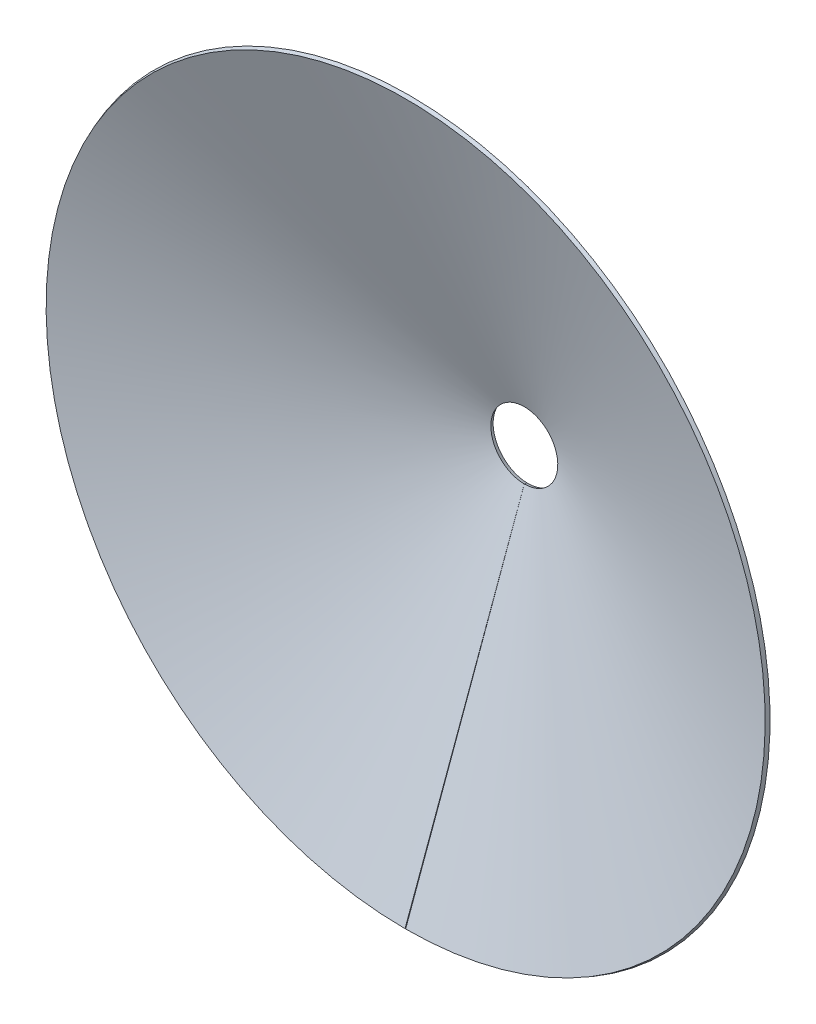
ISO-10303-21;
HEADER;
FILE_DESCRIPTION(('STEP AP214'),'2;1');
FILE_NAME('part.step','',(''),(''),'','','');
FILE_SCHEMA(('AUTOMOTIVE_DESIGN { 1 0 10303 214 1 1 1 1 }'));
ENDSEC;
DATA;
#1=APPLICATION_CONTEXT('core data for automotive mechanical design processes');
#2=APPLICATION_PROTOCOL_DEFINITION('international standard','automotive_design',2000,#1);
#3=PRODUCT_CONTEXT('',#1,'mechanical');
#4=PRODUCT('Part','Part','',(#3));
#5=PRODUCT_RELATED_PRODUCT_CATEGORY('part','',(#4));
#6=PRODUCT_DEFINITION_FORMATION('','',#4);
#7=PRODUCT_DEFINITION_CONTEXT('part definition',#1,'design');
#8=PRODUCT_DEFINITION('design','',#6,#7);
#9=PRODUCT_DEFINITION_SHAPE('','',#8);
#10=(LENGTH_UNIT() NAMED_UNIT(*) SI_UNIT(.MILLI.,.METRE.));
#11=(NAMED_UNIT(*) PLANE_ANGLE_UNIT() SI_UNIT($,.RADIAN.));
#12=(NAMED_UNIT(*) SI_UNIT($,.STERADIAN.) SOLID_ANGLE_UNIT());
#13=UNCERTAINTY_MEASURE_WITH_UNIT(LENGTH_MEASURE(1.E-05),#10,'distance_accuracy_value','');
#14=(GEOMETRIC_REPRESENTATION_CONTEXT(3) GLOBAL_UNCERTAINTY_ASSIGNED_CONTEXT((#13)) GLOBAL_UNIT_ASSIGNED_CONTEXT((#10,
#11,#12)) REPRESENTATION_CONTEXT('',''));
#15=CARTESIAN_POINT('',(0.,0.,0.));
#16=DIRECTION('',(0.,0.,1.));
#17=DIRECTION('',(1.,0.,0.));
#18=AXIS2_PLACEMENT_3D('',#15,#16,#17);
#19=CARTESIAN_POINT('',(0.,-150.4,49.6455399539095));
#20=DIRECTION('',(-1.,0.,0.));
#21=DIRECTION('',(0.,0.93969262078591,-0.342020143325666));
#22=AXIS2_PLACEMENT_3D('',#19,#20,#21);
#23=PLANE('',#22);
#24=DIRECTION('',(0.,-0.342020143325665,-0.93969262078591));
#25=VECTOR('',#24,1.);
#26=CARTESIAN_POINT('',(0.,-150.4,49.6455399539095));
#27=LINE('',#26,#25);
#28=CARTESIAN_POINT('',(0.,-150.4,49.6455399539095));
#29=VERTEX_POINT('',#28);
#30=CARTESIAN_POINT('',(0.,-150.94295697753,48.1537779184119));
#31=VERTEX_POINT('',#30);
#32=EDGE_CURVE('E12',#29,#31,#27,.T.);
#33=ORIENTED_EDGE('',*,*,#32,.F.);
#34=DIRECTION('',(0.,0.93969262078591,-0.342020143325666));
#35=VECTOR('',#34,1.);
#36=CARTESIAN_POINT('',(0.,-150.4,49.6455399539095));
#37=LINE('',#36,#35);
#38=CARTESIAN_POINT('',(0.,-14.,0.));
#39=VERTEX_POINT('',#38);
#40=EDGE_CURVE('E113',#29,#39,#37,.T.);
#41=ORIENTED_EDGE('',*,*,#40,.T.);
#42=DIRECTION('',(0.,-0.342020143325665,-0.93969262078591));
#43=VECTOR('',#42,1.);
#44=CARTESIAN_POINT('',(0.,-14.,0.));
#45=LINE('',#44,#43);
#46=CARTESIAN_POINT('',(0.,-14.5429569775295,-1.49176203549762));
#47=VERTEX_POINT('',#46);
#48=EDGE_CURVE('E65',#39,#47,#45,.T.);
#49=ORIENTED_EDGE('',*,*,#48,.T.);
#50=DIRECTION('',(0.,-0.93969262078591,0.342020143325665));
#51=VECTOR('',#50,1.);
#52=CARTESIAN_POINT('',(0.,-150.94295697753,48.1537779184119));
#53=LINE('',#52,#51);
#54=EDGE_CURVE('E122',#31,#47,#53,.F.);
#55=ORIENTED_EDGE('',*,*,#54,.F.);
#56=EDGE_LOOP('',(#33,#41,#49,#55));
#57=FACE_BOUND('',#56,.T.);
#58=ADVANCED_FACE('F52',(#57),#23,.T.);
#59=CARTESIAN_POINT('',(0.,0.,0.));
#60=DIRECTION('',(0.,0.,-1.));
#61=DIRECTION('',(-1.,0.,0.));
#62=AXIS2_PLACEMENT_3D('',#59,#60,#61);
#63=CONICAL_SURFACE('',#62,14.,0.349065850398862);
#64=ORIENTED_EDGE('',*,*,#48,.F.);
#65=CARTESIAN_POINT('',(0.,0.,0.));
#66=DIRECTION('',(0.,0.,1.));
#67=DIRECTION('',(1.,0.,0.));
#68=AXIS2_PLACEMENT_3D('',#65,#66,#67);
#69=CIRCLE('',#68,14.);
#70=CARTESIAN_POINT('',(-0.0244345971225684,-13.999978676786,0.));
#71=VERTEX_POINT('',#70);
#72=EDGE_CURVE('E112',#39,#71,#69,.T.);
#73=ORIENTED_EDGE('',*,*,#72,.T.);
#74=DIRECTION('',(-0.000596937457854695,-0.34201962239933,-0.93969262078591));
#75=VECTOR('',#74,1.);
#76=CARTESIAN_POINT('',(-0.0244345971225684,-13.999978676786,0.));
#77=LINE('',#76,#75);
#78=CARTESIAN_POINT('',(-0.025382235336922,-14.542934827345,-1.49176203549762));
#79=VERTEX_POINT('',#78);
#80=EDGE_CURVE('E94',#71,#79,#77,.T.);
#81=ORIENTED_EDGE('',*,*,#80,.T.);
#82=CARTESIAN_POINT('',(0.,0.,-1.49176203549762));
#83=DIRECTION('',(0.,0.,1.));
#84=DIRECTION('',(1.,0.,0.));
#85=AXIS2_PLACEMENT_3D('',#82,#83,#84);
#86=CIRCLE('',#85,14.5429569775295);
#87=EDGE_CURVE('E127',#47,#79,#86,.T.);
#88=ORIENTED_EDGE('',*,*,#87,.F.);
#89=EDGE_LOOP('',(#64,#73,#81,#88));
#90=FACE_BOUND('',#89,.T.);
#91=ADVANCED_FACE('F111',(#90),#63,.F.);
#92=CARTESIAN_POINT('',(-0.26249738623102,-150.399770927759,49.6455399539095));
#93=DIRECTION('',(-0.999998476913288,0.00174532836589774,0.));
#94=DIRECTION('',(0.00164007218628244,0.939691189552565,-0.342020143325666));
#95=AXIS2_PLACEMENT_3D('',#92,#93,#94);
#96=PLANE('',#95);
#97=ORIENTED_EDGE('',*,*,#80,.F.);
#98=DIRECTION('',(0.00164007218628244,0.939691189552565,-0.342020143325666));
#99=VECTOR('',#98,1.);
#100=CARTESIAN_POINT('',(-0.26249738623102,-150.399770927759,49.6455399539095));
#101=LINE('',#100,#99);
#102=CARTESIAN_POINT('',(-0.26249738623102,-150.399770927759,49.6455399539095));
#103=VERTEX_POINT('',#102);
#104=EDGE_CURVE('E100',#103,#71,#101,.T.);
#105=ORIENTED_EDGE('',*,*,#104,.F.);
#106=DIRECTION('',(-0.000596937457854695,-0.34201962239933,-0.93969262078591));
#107=VECTOR('',#106,1.);
#108=CARTESIAN_POINT('',(-0.26249738623102,-150.399770927759,49.6455399539095));
#109=LINE('',#108,#107);
#110=CARTESIAN_POINT('',(-0.263445024445462,-150.942727078317,48.1537779184119));
#111=VERTEX_POINT('',#110);
#112=EDGE_CURVE('E60',#103,#111,#109,.T.);
#113=ORIENTED_EDGE('',*,*,#112,.T.);
#114=DIRECTION('',(-0.00164007218628304,-0.939691189552565,0.342020143325665));
#115=VECTOR('',#114,1.);
#116=CARTESIAN_POINT('',(-0.263445024445462,-150.942727078317,48.1537779184119));
#117=LINE('',#116,#115);
#118=EDGE_CURVE('E97',#111,#79,#117,.F.);
#119=ORIENTED_EDGE('',*,*,#118,.T.);
#120=EDGE_LOOP('',(#97,#105,#113,#119));
#121=FACE_BOUND('',#120,.T.);
#122=ADVANCED_FACE('F96',(#121),#96,.F.);
#123=CARTESIAN_POINT('',(0.,0.,49.6455399539095));
#124=DIRECTION('',(0.,0.,-1.));
#125=DIRECTION('',(-1.,0.,0.));
#126=AXIS2_PLACEMENT_3D('',#123,#124,#125);
#127=CONICAL_SURFACE('',#126,150.4,0.349065850398862);
#128=CARTESIAN_POINT('',(0.,0.,49.6455399539095));
#129=DIRECTION('',(0.,0.,1.));
#130=DIRECTION('',(1.,0.,0.));
#131=AXIS2_PLACEMENT_3D('',#128,#129,#130);
#132=CIRCLE('',#131,150.4);
#133=EDGE_CURVE('E115',#29,#103,#132,.T.);
#134=ORIENTED_EDGE('',*,*,#133,.F.);
#135=ORIENTED_EDGE('',*,*,#32,.T.);
#136=CARTESIAN_POINT('',(0.,0.,48.1537779184119));
#137=DIRECTION('',(0.,0.,1.));
#138=DIRECTION('',(1.,0.,0.));
#139=AXIS2_PLACEMENT_3D('',#136,#137,#138);
#140=CIRCLE('',#139,150.94295697753);
#141=EDGE_CURVE('E119',#31,#111,#140,.T.);
#142=ORIENTED_EDGE('',*,*,#141,.T.);
#143=ORIENTED_EDGE('',*,*,#112,.F.);
#144=EDGE_LOOP('',(#134,#135,#142,#143));
#145=FACE_BOUND('',#144,.T.);
#146=ADVANCED_FACE('F54',(#145),#127,.T.);
#147=CARTESIAN_POINT('',(0.,0.,48.1537779184119));
#148=DIRECTION('',(0.,0.,1.));
#149=DIRECTION('',(1.,0.,0.));
#150=AXIS2_PLACEMENT_3D('',#147,#148,#149);
#151=CONICAL_SURFACE('',#150,150.94295697753,1.22173047639603);
#152=ORIENTED_EDGE('',*,*,#118,.F.);
#153=ORIENTED_EDGE('',*,*,#141,.F.);
#154=ORIENTED_EDGE('',*,*,#54,.T.);
#155=ORIENTED_EDGE('',*,*,#87,.T.);
#156=EDGE_LOOP('',(#152,#153,#154,#155));
#157=FACE_BOUND('',#156,.T.);
#158=ADVANCED_FACE('F129',(#157),#151,.T.);
#159=CARTESIAN_POINT('',(0.,0.,49.6455399539095));
#160=DIRECTION('',(0.,0.,1.));
#161=DIRECTION('',(1.,0.,0.));
#162=AXIS2_PLACEMENT_3D('',#159,#160,#161);
#163=CONICAL_SURFACE('',#162,150.4,1.22173047639603);
#164=ORIENTED_EDGE('',*,*,#104,.T.);
#165=ORIENTED_EDGE('',*,*,#72,.F.);
#166=ORIENTED_EDGE('',*,*,#40,.F.);
#167=ORIENTED_EDGE('',*,*,#133,.T.);
#168=EDGE_LOOP('',(#164,#165,#166,#167));
#169=FACE_BOUND('',#168,.T.);
#170=ADVANCED_FACE('F108',(#169),#163,.F.);
#171=CLOSED_SHELL('',(#58,#91,#122,#146,#158,#170));
#172=MANIFOLD_SOLID_BREP('B2',#171);
#173=ADVANCED_BREP_SHAPE_REPRESENTATION('',(#18,#172),#14);
#174=SHAPE_DEFINITION_REPRESENTATION(#9,#173);
ENDSEC;
END-ISO-10303-21;
